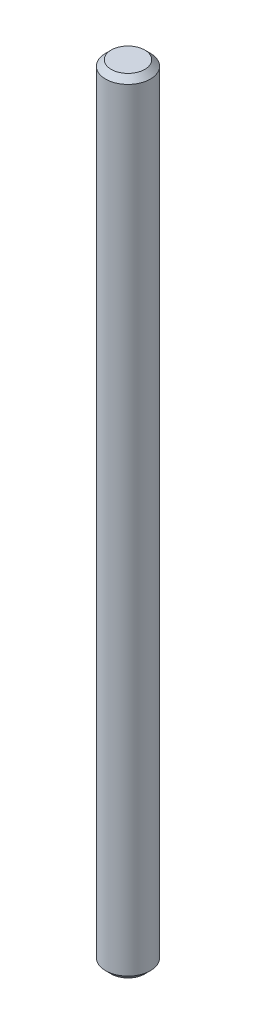
ISO-10303-21;
HEADER;
FILE_DESCRIPTION(('STEP AP214'),'2;1');
FILE_NAME('part.step','',(''),(''),'','','');
FILE_SCHEMA(('AUTOMOTIVE_DESIGN { 1 0 10303 214 1 1 1 1 }'));
ENDSEC;
DATA;
#1=APPLICATION_CONTEXT('core data for automotive mechanical design processes');
#2=APPLICATION_PROTOCOL_DEFINITION('international standard','automotive_design',2000,#1);
#3=PRODUCT_CONTEXT('',#1,'mechanical');
#4=PRODUCT('Part','Part','',(#3));
#5=PRODUCT_RELATED_PRODUCT_CATEGORY('part','',(#4));
#6=PRODUCT_DEFINITION_FORMATION('','',#4);
#7=PRODUCT_DEFINITION_CONTEXT('part definition',#1,'design');
#8=PRODUCT_DEFINITION('design','',#6,#7);
#9=PRODUCT_DEFINITION_SHAPE('','',#8);
#10=(LENGTH_UNIT() NAMED_UNIT(*) SI_UNIT(.MILLI.,.METRE.));
#11=(NAMED_UNIT(*) PLANE_ANGLE_UNIT() SI_UNIT($,.RADIAN.));
#12=(NAMED_UNIT(*) SI_UNIT($,.STERADIAN.) SOLID_ANGLE_UNIT());
#13=UNCERTAINTY_MEASURE_WITH_UNIT(LENGTH_MEASURE(1.E-05),#10,'distance_accuracy_value','');
#14=(GEOMETRIC_REPRESENTATION_CONTEXT(3) GLOBAL_UNCERTAINTY_ASSIGNED_CONTEXT((#13)) GLOBAL_UNIT_ASSIGNED_CONTEXT((#10,
#11,#12)) REPRESENTATION_CONTEXT('',''));
#15=CARTESIAN_POINT('',(0.,0.,0.));
#16=DIRECTION('',(0.,0.,1.));
#17=DIRECTION('',(1.,0.,0.));
#18=AXIS2_PLACEMENT_3D('',#15,#16,#17);
#19=CARTESIAN_POINT('',(0.,140.,0.));
#20=DIRECTION('',(0.,-1.,0.));
#21=DIRECTION('',(0.,0.,-1.));
#22=AXIS2_PLACEMENT_3D('',#19,#20,#21);
#23=CYLINDRICAL_SURFACE('',#22,4.);
#24=CARTESIAN_POINT('',(0.,1.,0.));
#25=DIRECTION('',(0.,1.,0.));
#26=DIRECTION('',(0.,0.,1.));
#27=AXIS2_PLACEMENT_3D('',#24,#25,#26);
#28=CIRCLE('',#27,4.);
#29=CARTESIAN_POINT('',(0.,1.,4.));
#30=VERTEX_POINT('',#29);
#31=EDGE_CURVE('E146',#30,#30,#28,.T.);
#32=ORIENTED_EDGE('',*,*,#31,.T.);
#33=EDGE_LOOP('',(#32));
#34=FACE_BOUND('',#33,.T.);
#35=CARTESIAN_POINT('',(0.,139.,0.));
#36=DIRECTION('',(0.,1.,0.));
#37=DIRECTION('',(0.,0.,1.));
#38=AXIS2_PLACEMENT_3D('',#35,#36,#37);
#39=CIRCLE('',#38,4.);
#40=CARTESIAN_POINT('',(0.,139.,4.));
#41=VERTEX_POINT('',#40);
#42=EDGE_CURVE('E153',#41,#41,#39,.F.);
#43=ORIENTED_EDGE('',*,*,#42,.T.);
#44=EDGE_LOOP('',(#43));
#45=FACE_BOUND('',#44,.T.);
#46=ADVANCED_FACE('F130',(#34,#45),#23,.T.);
#47=CARTESIAN_POINT('',(0.,140.,0.));
#48=DIRECTION('',(0.,1.,0.));
#49=DIRECTION('',(0.,0.,1.));
#50=AXIS2_PLACEMENT_3D('',#47,#48,#49);
#51=PLANE('',#50);
#52=CARTESIAN_POINT('',(0.,140.,0.));
#53=DIRECTION('',(0.,1.,0.));
#54=DIRECTION('',(0.,0.,1.));
#55=AXIS2_PLACEMENT_3D('',#52,#53,#54);
#56=CIRCLE('',#55,3.);
#57=CARTESIAN_POINT('',(0.,140.,3.));
#58=VERTEX_POINT('',#57);
#59=EDGE_CURVE('E11',#58,#58,#56,.T.);
#60=ORIENTED_EDGE('',*,*,#59,.T.);
#61=EDGE_LOOP('',(#60));
#62=FACE_BOUND('',#61,.T.);
#63=ADVANCED_FACE('F172',(#62),#51,.T.);
#64=CARTESIAN_POINT('',(0.,0.,0.));
#65=DIRECTION('',(0.,1.,0.));
#66=DIRECTION('',(0.,0.,1.));
#67=AXIS2_PLACEMENT_3D('',#64,#65,#66);
#68=PLANE('',#67);
#69=CARTESIAN_POINT('',(0.,0.,0.));
#70=DIRECTION('',(0.,1.,0.));
#71=DIRECTION('',(0.,0.,1.));
#72=AXIS2_PLACEMENT_3D('',#69,#70,#71);
#73=CIRCLE('',#72,2.99999999999999);
#74=CARTESIAN_POINT('',(0.,0.,2.99999999999999));
#75=VERTEX_POINT('',#74);
#76=EDGE_CURVE('E139',#75,#75,#73,.F.);
#77=ORIENTED_EDGE('',*,*,#76,.T.);
#78=EDGE_LOOP('',(#77));
#79=FACE_BOUND('',#78,.T.);
#80=ADVANCED_FACE('F169',(#79),#68,.F.);
#81=CARTESIAN_POINT('',(0.,1.,0.));
#82=DIRECTION('',(0.,1.,0.));
#83=DIRECTION('',(0.,0.,1.));
#84=AXIS2_PLACEMENT_3D('',#81,#82,#83);
#85=CONICAL_SURFACE('',#84,4.,0.785398163397454);
#86=ORIENTED_EDGE('',*,*,#76,.F.);
#87=EDGE_LOOP('',(#86));
#88=FACE_BOUND('',#87,.T.);
#89=ORIENTED_EDGE('',*,*,#31,.F.);
#90=EDGE_LOOP('',(#89));
#91=FACE_BOUND('',#90,.T.);
#92=ADVANCED_FACE('F165',(#88,#91),#85,.T.);
#93=CARTESIAN_POINT('',(0.,140.,0.));
#94=DIRECTION('',(0.,-1.,0.));
#95=DIRECTION('',(0.,0.,-1.));
#96=AXIS2_PLACEMENT_3D('',#93,#94,#95);
#97=CONICAL_SURFACE('',#96,3.,0.785398163397447);
#98=ORIENTED_EDGE('',*,*,#42,.F.);
#99=EDGE_LOOP('',(#98));
#100=FACE_BOUND('',#99,.T.);
#101=ORIENTED_EDGE('',*,*,#59,.F.);
#102=EDGE_LOOP('',(#101));
#103=FACE_BOUND('',#102,.T.);
#104=ADVANCED_FACE('F133',(#100,#103),#97,.T.);
#105=CLOSED_SHELL('',(#46,#63,#80,#92,#104));
#106=MANIFOLD_SOLID_BREP('B2',#105);
#107=ADVANCED_BREP_SHAPE_REPRESENTATION('',(#18,#106),#14);
#108=SHAPE_DEFINITION_REPRESENTATION(#9,#107);
ENDSEC;
END-ISO-10303-21;
